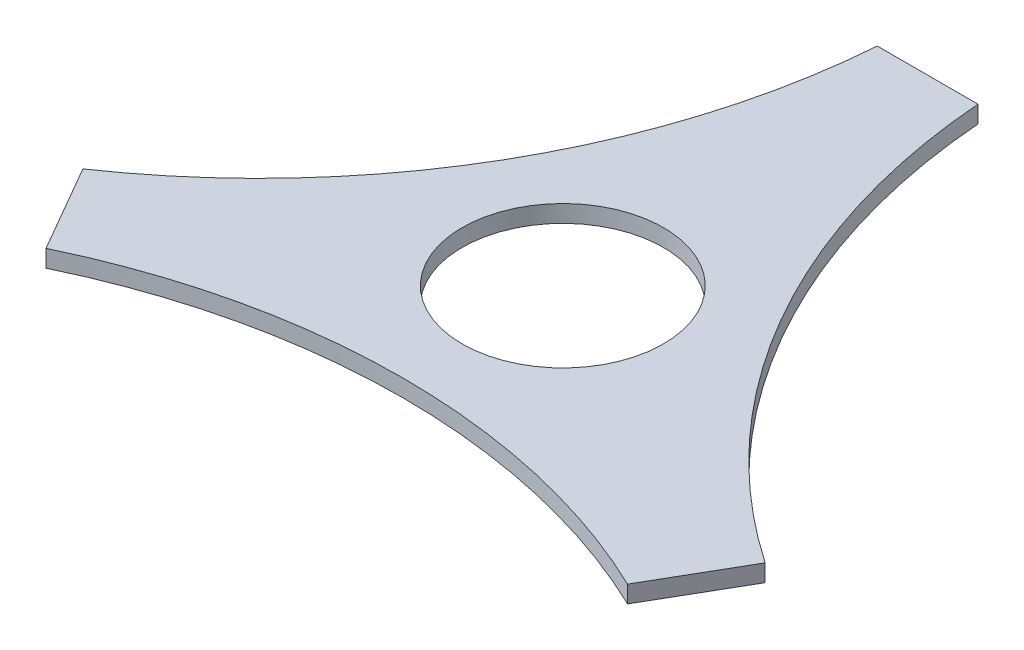
ISO-10303-21;
HEADER;
FILE_DESCRIPTION(('STEP AP214'),'2;1');
FILE_NAME('part.step','',(''),(''),'','','');
FILE_SCHEMA(('AUTOMOTIVE_DESIGN { 1 0 10303 214 1 1 1 1 }'));
ENDSEC;
DATA;
#1=APPLICATION_CONTEXT('core data for automotive mechanical design processes');
#2=APPLICATION_PROTOCOL_DEFINITION('international standard','automotive_design',2000,#1);
#3=PRODUCT_CONTEXT('',#1,'mechanical');
#4=PRODUCT('Part','Part','',(#3));
#5=PRODUCT_RELATED_PRODUCT_CATEGORY('part','',(#4));
#6=PRODUCT_DEFINITION_FORMATION('','',#4);
#7=PRODUCT_DEFINITION_CONTEXT('part definition',#1,'design');
#8=PRODUCT_DEFINITION('design','',#6,#7);
#9=PRODUCT_DEFINITION_SHAPE('','',#8);
#10=(LENGTH_UNIT() NAMED_UNIT(*) SI_UNIT(.MILLI.,.METRE.));
#11=(NAMED_UNIT(*) PLANE_ANGLE_UNIT() SI_UNIT($,.RADIAN.));
#12=(NAMED_UNIT(*) SI_UNIT($,.STERADIAN.) SOLID_ANGLE_UNIT());
#13=UNCERTAINTY_MEASURE_WITH_UNIT(LENGTH_MEASURE(1.E-05),#10,'distance_accuracy_value','');
#14=(GEOMETRIC_REPRESENTATION_CONTEXT(3) GLOBAL_UNCERTAINTY_ASSIGNED_CONTEXT((#13)) GLOBAL_UNIT_ASSIGNED_CONTEXT((#10,
#11,#12)) REPRESENTATION_CONTEXT('',''));
#15=CARTESIAN_POINT('',(0.,0.,0.));
#16=DIRECTION('',(0.,0.,1.));
#17=DIRECTION('',(1.,0.,0.));
#18=AXIS2_PLACEMENT_3D('',#15,#16,#17);
#19=CARTESIAN_POINT('',(-59.7551131403119,1.6256,34.4996306570156));
#20=DIRECTION('',(-0.866025403784439,0.,0.5));
#21=DIRECTION('',(0.5,0.,0.866025403784439));
#22=AXIS2_PLACEMENT_3D('',#19,#20,#21);
#23=PLANE('',#22);
#24=DIRECTION('',(-0.5,0.,-0.866025403784439));
#25=VECTOR('',#24,1.);
#26=CARTESIAN_POINT('',(-59.7551131403119,-1.6256,34.4996306570156));
#27=LINE('',#26,#25);
#28=CARTESIAN_POINT('',(-54.9926131403119,-1.6256,42.7485226280624));
#29=VERTEX_POINT('',#28);
#30=CARTESIAN_POINT('',(-64.5176131403119,-1.6256,26.2507386859688));
#31=VERTEX_POINT('',#30);
#32=EDGE_CURVE('E116',#29,#31,#27,.T.);
#33=ORIENTED_EDGE('',*,*,#32,.F.);
#34=DIRECTION('',(0.,-1.,0.));
#35=VECTOR('',#34,1.);
#36=CARTESIAN_POINT('',(-54.9926131403119,1.6256,42.7485226280624));
#37=LINE('',#36,#35);
#38=CARTESIAN_POINT('',(-54.9926131403119,1.6256,42.7485226280624));
#39=VERTEX_POINT('',#38);
#40=EDGE_CURVE('E11',#39,#29,#37,.T.);
#41=ORIENTED_EDGE('',*,*,#40,.F.);
#42=DIRECTION('',(-0.5,0.,-0.866025403784439));
#43=VECTOR('',#42,1.);
#44=CARTESIAN_POINT('',(-59.7551131403119,1.6256,34.4996306570156));
#45=LINE('',#44,#43);
#46=CARTESIAN_POINT('',(-64.5176131403119,1.6256,26.2507386859688));
#47=VERTEX_POINT('',#46);
#48=EDGE_CURVE('E131',#39,#47,#45,.T.);
#49=ORIENTED_EDGE('',*,*,#48,.T.);
#50=DIRECTION('',(0.,-1.,0.));
#51=VECTOR('',#50,1.);
#52=CARTESIAN_POINT('',(-64.5176131403119,1.6256,26.2507386859688));
#53=LINE('',#52,#51);
#54=EDGE_CURVE('E51',#47,#31,#53,.T.);
#55=ORIENTED_EDGE('',*,*,#54,.T.);
#56=EDGE_LOOP('',(#33,#41,#49,#55));
#57=FACE_BOUND('',#56,.T.);
#58=ADVANCED_FACE('F35',(#57),#23,.T.);
#59=CARTESIAN_POINT('',(0.,1.6256,157.224775624044));
#60=DIRECTION('',(0.,-1.,0.));
#61=DIRECTION('',(0.,0.,-1.));
#62=AXIS2_PLACEMENT_3D('',#59,#60,#61);
#63=CYLINDRICAL_SURFACE('',#62,127.);
#64=CARTESIAN_POINT('',(0.,-1.6256,157.224775624044));
#65=DIRECTION('',(0.,1.,0.));
#66=DIRECTION('',(0.,0.,1.));
#67=AXIS2_PLACEMENT_3D('',#64,#65,#66);
#68=CIRCLE('',#67,127.);
#69=CARTESIAN_POINT('',(54.9926131403119,-1.6256,42.7485226280624));
#70=VERTEX_POINT('',#69);
#71=EDGE_CURVE('E118',#70,#29,#68,.T.);
#72=ORIENTED_EDGE('',*,*,#71,.F.);
#73=DIRECTION('',(0.,-1.,0.));
#74=VECTOR('',#73,1.);
#75=CARTESIAN_POINT('',(54.9926131403119,1.6256,42.7485226280624));
#76=LINE('',#75,#74);
#77=CARTESIAN_POINT('',(54.9926131403119,1.6256,42.7485226280624));
#78=VERTEX_POINT('',#77);
#79=EDGE_CURVE('E43',#78,#70,#76,.T.);
#80=ORIENTED_EDGE('',*,*,#79,.F.);
#81=CARTESIAN_POINT('',(0.,1.6256,157.224775624044));
#82=DIRECTION('',(0.,1.,0.));
#83=DIRECTION('',(0.,0.,1.));
#84=AXIS2_PLACEMENT_3D('',#81,#82,#83);
#85=CIRCLE('',#84,127.);
#86=EDGE_CURVE('E218',#78,#39,#85,.T.);
#87=ORIENTED_EDGE('',*,*,#86,.T.);
#88=ORIENTED_EDGE('',*,*,#40,.T.);
#89=EDGE_LOOP('',(#72,#80,#87,#88));
#90=FACE_BOUND('',#89,.T.);
#91=ADVANCED_FACE('F140',(#90),#63,.F.);
#92=CARTESIAN_POINT('',(59.7551131403118,1.6256,34.4996306570156));
#93=DIRECTION('',(0.866025403784438,0.,0.5));
#94=DIRECTION('',(0.5,0.,-0.866025403784438));
#95=AXIS2_PLACEMENT_3D('',#92,#93,#94);
#96=PLANE('',#95);
#97=DIRECTION('',(-0.5,0.,0.866025403784438));
#98=VECTOR('',#97,1.);
#99=CARTESIAN_POINT('',(59.7551131403118,-1.6256,34.4996306570156));
#100=LINE('',#99,#98);
#101=CARTESIAN_POINT('',(64.5176131403119,-1.6256,26.2507386859688));
#102=VERTEX_POINT('',#101);
#103=EDGE_CURVE('E122',#102,#70,#100,.T.);
#104=ORIENTED_EDGE('',*,*,#103,.F.);
#105=DIRECTION('',(0.,-1.,0.));
#106=VECTOR('',#105,1.);
#107=CARTESIAN_POINT('',(64.5176131403119,1.6256,26.2507386859688));
#108=LINE('',#107,#106);
#109=CARTESIAN_POINT('',(64.5176131403119,1.6256,26.2507386859688));
#110=VERTEX_POINT('',#109);
#111=EDGE_CURVE('E98',#110,#102,#108,.T.);
#112=ORIENTED_EDGE('',*,*,#111,.F.);
#113=DIRECTION('',(-0.5,0.,0.866025403784438));
#114=VECTOR('',#113,1.);
#115=CARTESIAN_POINT('',(59.7551131403118,1.6256,34.4996306570156));
#116=LINE('',#115,#114);
#117=EDGE_CURVE('E108',#110,#78,#116,.T.);
#118=ORIENTED_EDGE('',*,*,#117,.T.);
#119=ORIENTED_EDGE('',*,*,#79,.T.);
#120=EDGE_LOOP('',(#104,#112,#118,#119));
#121=FACE_BOUND('',#120,.T.);
#122=ADVANCED_FACE('F137',(#121),#96,.T.);
#123=CARTESIAN_POINT('',(136.160649794731,1.6256,-78.612387812022));
#124=DIRECTION('',(0.,-1.,0.));
#125=DIRECTION('',(0.,0.,-1.));
#126=AXIS2_PLACEMENT_3D('',#123,#124,#125);
#127=CYLINDRICAL_SURFACE('',#126,127.);
#128=CARTESIAN_POINT('',(136.160649794731,-1.6256,-78.612387812022));
#129=DIRECTION('',(0.,1.,0.));
#130=DIRECTION('',(0.,0.,1.));
#131=AXIS2_PLACEMENT_3D('',#128,#129,#130);
#132=CIRCLE('',#131,127.);
#133=CARTESIAN_POINT('',(9.525,-1.6256,-68.9992613140312));
#134=VERTEX_POINT('',#133);
#135=EDGE_CURVE('E94',#134,#102,#132,.T.);
#136=ORIENTED_EDGE('',*,*,#135,.F.);
#137=DIRECTION('',(0.,-1.,0.));
#138=VECTOR('',#137,1.);
#139=CARTESIAN_POINT('',(9.525,1.6256,-68.9992613140312));
#140=LINE('',#139,#138);
#141=CARTESIAN_POINT('',(9.525,1.6256,-68.9992613140312));
#142=VERTEX_POINT('',#141);
#143=EDGE_CURVE('E89',#142,#134,#140,.T.);
#144=ORIENTED_EDGE('',*,*,#143,.F.);
#145=CARTESIAN_POINT('',(136.160649794731,1.6256,-78.612387812022));
#146=DIRECTION('',(0.,1.,0.));
#147=DIRECTION('',(0.,0.,1.));
#148=AXIS2_PLACEMENT_3D('',#145,#146,#147);
#149=CIRCLE('',#148,127.);
#150=EDGE_CURVE('E92',#142,#110,#149,.T.);
#151=ORIENTED_EDGE('',*,*,#150,.T.);
#152=ORIENTED_EDGE('',*,*,#111,.T.);
#153=EDGE_LOOP('',(#136,#144,#151,#152));
#154=FACE_BOUND('',#153,.T.);
#155=ADVANCED_FACE('F91',(#154),#127,.F.);
#156=CARTESIAN_POINT('',(0.,1.6256,-68.9992613140312));
#157=DIRECTION('',(0.,0.,-1.));
#158=DIRECTION('',(-1.,0.,0.));
#159=AXIS2_PLACEMENT_3D('',#156,#157,#158);
#160=PLANE('',#159);
#161=DIRECTION('',(1.,0.,0.));
#162=VECTOR('',#161,1.);
#163=CARTESIAN_POINT('',(0.,-1.6256,-68.9992613140312));
#164=LINE('',#163,#162);
#165=CARTESIAN_POINT('',(-9.525,-1.6256,-68.9992613140312));
#166=VERTEX_POINT('',#165);
#167=EDGE_CURVE('E126',#166,#134,#164,.T.);
#168=ORIENTED_EDGE('',*,*,#167,.F.);
#169=DIRECTION('',(0.,-1.,0.));
#170=VECTOR('',#169,1.);
#171=CARTESIAN_POINT('',(-9.525,1.6256,-68.9992613140312));
#172=LINE('',#171,#170);
#173=CARTESIAN_POINT('',(-9.525,1.6256,-68.9992613140312));
#174=VERTEX_POINT('',#173);
#175=EDGE_CURVE('E70',#174,#166,#172,.T.);
#176=ORIENTED_EDGE('',*,*,#175,.F.);
#177=DIRECTION('',(1.,0.,0.));
#178=VECTOR('',#177,1.);
#179=CARTESIAN_POINT('',(0.,1.6256,-68.9992613140312));
#180=LINE('',#179,#178);
#181=EDGE_CURVE('E105',#174,#142,#180,.T.);
#182=ORIENTED_EDGE('',*,*,#181,.T.);
#183=ORIENTED_EDGE('',*,*,#143,.T.);
#184=EDGE_LOOP('',(#168,#176,#182,#183));
#185=FACE_BOUND('',#184,.T.);
#186=ADVANCED_FACE('F110',(#185),#160,.T.);
#187=CARTESIAN_POINT('',(-136.160649794731,1.6256,-78.612387812022));
#188=DIRECTION('',(0.,-1.,0.));
#189=DIRECTION('',(0.,0.,-1.));
#190=AXIS2_PLACEMENT_3D('',#187,#188,#189);
#191=CYLINDRICAL_SURFACE('',#190,127.);
#192=CARTESIAN_POINT('',(-136.160649794731,-1.6256,-78.612387812022));
#193=DIRECTION('',(0.,1.,0.));
#194=DIRECTION('',(0.,0.,1.));
#195=AXIS2_PLACEMENT_3D('',#192,#193,#194);
#196=CIRCLE('',#195,127.);
#197=EDGE_CURVE('E128',#31,#166,#196,.T.);
#198=ORIENTED_EDGE('',*,*,#197,.F.);
#199=ORIENTED_EDGE('',*,*,#54,.F.);
#200=CARTESIAN_POINT('',(-136.160649794731,1.6256,-78.612387812022));
#201=DIRECTION('',(0.,1.,0.));
#202=DIRECTION('',(0.,0.,1.));
#203=AXIS2_PLACEMENT_3D('',#200,#201,#202);
#204=CIRCLE('',#203,127.);
#205=EDGE_CURVE('E111',#47,#174,#204,.T.);
#206=ORIENTED_EDGE('',*,*,#205,.T.);
#207=ORIENTED_EDGE('',*,*,#175,.T.);
#208=EDGE_LOOP('',(#198,#199,#206,#207));
#209=FACE_BOUND('',#208,.T.);
#210=ADVANCED_FACE('F143',(#209),#191,.F.);
#211=CARTESIAN_POINT('',(0.,1.6256,0.));
#212=DIRECTION('',(0.,1.,0.));
#213=DIRECTION('',(0.,0.,1.));
#214=AXIS2_PLACEMENT_3D('',#211,#212,#213);
#215=PLANE('',#214);
#216=CARTESIAN_POINT('',(0.,1.6256,0.));
#217=DIRECTION('',(0.,1.,0.));
#218=DIRECTION('',(0.,0.,1.));
#219=AXIS2_PLACEMENT_3D('',#216,#217,#218);
#220=CIRCLE('',#219,19.05);
#221=CARTESIAN_POINT('',(0.,1.6256,19.05));
#222=VERTEX_POINT('',#221);
#223=EDGE_CURVE('E213',#222,#222,#220,.T.);
#224=ORIENTED_EDGE('',*,*,#223,.F.);
#225=EDGE_LOOP('',(#224));
#226=FACE_BOUND('',#225,.T.);
#227=ORIENTED_EDGE('',*,*,#48,.F.);
#228=ORIENTED_EDGE('',*,*,#86,.F.);
#229=ORIENTED_EDGE('',*,*,#117,.F.);
#230=ORIENTED_EDGE('',*,*,#150,.F.);
#231=ORIENTED_EDGE('',*,*,#181,.F.);
#232=ORIENTED_EDGE('',*,*,#205,.F.);
#233=EDGE_LOOP('',(#227,#228,#229,#230,#231,#232));
#234=FACE_BOUND('',#233,.T.);
#235=ADVANCED_FACE('F103',(#226,#234),#215,.T.);
#236=CARTESIAN_POINT('',(0.,-1.6256,0.));
#237=DIRECTION('',(0.,1.,0.));
#238=DIRECTION('',(0.,0.,1.));
#239=AXIS2_PLACEMENT_3D('',#236,#237,#238);
#240=PLANE('',#239);
#241=CARTESIAN_POINT('',(0.,-1.6256,0.));
#242=DIRECTION('',(0.,1.,0.));
#243=DIRECTION('',(0.,0.,1.));
#244=AXIS2_PLACEMENT_3D('',#241,#242,#243);
#245=CIRCLE('',#244,19.05);
#246=CARTESIAN_POINT('',(0.,-1.6256,19.05));
#247=VERTEX_POINT('',#246);
#248=EDGE_CURVE('E119',#247,#247,#245,.T.);
#249=ORIENTED_EDGE('',*,*,#248,.T.);
#250=EDGE_LOOP('',(#249));
#251=FACE_BOUND('',#250,.T.);
#252=ORIENTED_EDGE('',*,*,#32,.T.);
#253=ORIENTED_EDGE('',*,*,#197,.T.);
#254=ORIENTED_EDGE('',*,*,#167,.T.);
#255=ORIENTED_EDGE('',*,*,#135,.T.);
#256=ORIENTED_EDGE('',*,*,#103,.T.);
#257=ORIENTED_EDGE('',*,*,#71,.T.);
#258=EDGE_LOOP('',(#252,#253,#254,#255,#256,#257));
#259=FACE_BOUND('',#258,.T.);
#260=ADVANCED_FACE('F142',(#251,#259),#240,.F.);
#261=CARTESIAN_POINT('',(0.,-1.6256,0.));
#262=DIRECTION('',(0.,1.,0.));
#263=DIRECTION('',(0.,0.,1.));
#264=AXIS2_PLACEMENT_3D('',#261,#262,#263);
#265=CYLINDRICAL_SURFACE('',#264,19.05);
#266=ORIENTED_EDGE('',*,*,#248,.F.);
#267=EDGE_LOOP('',(#266));
#268=FACE_BOUND('',#267,.T.);
#269=ORIENTED_EDGE('',*,*,#223,.T.);
#270=EDGE_LOOP('',(#269));
#271=FACE_BOUND('',#270,.T.);
#272=ADVANCED_FACE('F194',(#268,#271),#265,.F.);
#273=CLOSED_SHELL('',(#58,#91,#122,#155,#186,#210,#235,#260,#272));
#274=MANIFOLD_SOLID_BREP('B2',#273);
#275=ADVANCED_BREP_SHAPE_REPRESENTATION('',(#18,#274),#14);
#276=SHAPE_DEFINITION_REPRESENTATION(#9,#275);
ENDSEC;
END-ISO-10303-21;
